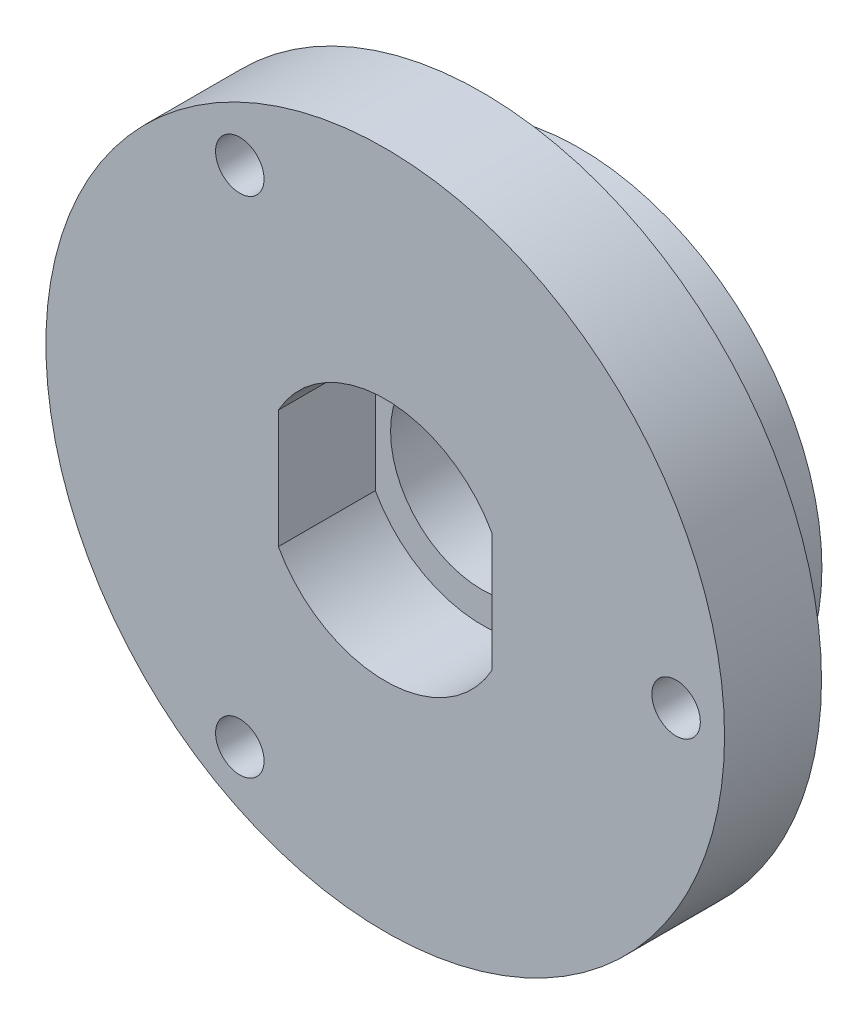
ISO-10303-21;
HEADER;
FILE_DESCRIPTION(('STEP AP214'),'2;1');
FILE_NAME('part.step','',(''),(''),'','','');
FILE_SCHEMA(('AUTOMOTIVE_DESIGN { 1 0 10303 214 1 1 1 1 }'));
ENDSEC;
DATA;
#1=APPLICATION_CONTEXT('core data for automotive mechanical design processes');
#2=APPLICATION_PROTOCOL_DEFINITION('international standard','automotive_design',2000,#1);
#3=PRODUCT_CONTEXT('',#1,'mechanical');
#4=PRODUCT('Part','Part','',(#3));
#5=PRODUCT_RELATED_PRODUCT_CATEGORY('part','',(#4));
#6=PRODUCT_DEFINITION_FORMATION('','',#4);
#7=PRODUCT_DEFINITION_CONTEXT('part definition',#1,'design');
#8=PRODUCT_DEFINITION('design','',#6,#7);
#9=PRODUCT_DEFINITION_SHAPE('','',#8);
#10=(LENGTH_UNIT() NAMED_UNIT(*) SI_UNIT(.MILLI.,.METRE.));
#11=(NAMED_UNIT(*) PLANE_ANGLE_UNIT() SI_UNIT($,.RADIAN.));
#12=(NAMED_UNIT(*) SI_UNIT($,.STERADIAN.) SOLID_ANGLE_UNIT());
#13=UNCERTAINTY_MEASURE_WITH_UNIT(LENGTH_MEASURE(1.E-05),#10,'distance_accuracy_value','');
#14=(GEOMETRIC_REPRESENTATION_CONTEXT(3) GLOBAL_UNCERTAINTY_ASSIGNED_CONTEXT((#13)) GLOBAL_UNIT_ASSIGNED_CONTEXT((#10,
#11,#12)) REPRESENTATION_CONTEXT('',''));
#15=CARTESIAN_POINT('',(0.,0.,0.));
#16=DIRECTION('',(0.,0.,1.));
#17=DIRECTION('',(1.,0.,0.));
#18=AXIS2_PLACEMENT_3D('',#15,#16,#17);
#19=CARTESIAN_POINT('',(0.,0.,6.3630063500127));
#20=DIRECTION('',(0.,0.,1.));
#21=DIRECTION('',(1.,0.,0.));
#22=AXIS2_PLACEMENT_3D('',#19,#20,#21);
#23=PLANE('',#22);
#24=CARTESIAN_POINT('',(-4.76250000000004,8.24889197104675,6.3630063500127));
#25=DIRECTION('',(0.,0.,1.));
#26=DIRECTION('',(1.,0.,0.));
#27=AXIS2_PLACEMENT_3D('',#24,#25,#26);
#28=CIRCLE('',#27,0.79375);
#29=CARTESIAN_POINT('',(-3.96875000000004,8.24889197104675,6.3630063500127));
#30=VERTEX_POINT('',#29);
#31=EDGE_CURVE('E189',#30,#30,#28,.T.);
#32=ORIENTED_EDGE('',*,*,#31,.F.);
#33=EDGE_LOOP('',(#32));
#34=FACE_BOUND('',#33,.T.);
#35=CARTESIAN_POINT('',(9.525,0.,6.3630063500127));
#36=DIRECTION('',(0.,0.,1.));
#37=DIRECTION('',(1.,0.,0.));
#38=AXIS2_PLACEMENT_3D('',#35,#36,#37);
#39=CIRCLE('',#38,0.793749999999999);
#40=CARTESIAN_POINT('',(10.31875,0.,6.3630063500127));
#41=VERTEX_POINT('',#40);
#42=EDGE_CURVE('E203',#41,#41,#39,.T.);
#43=ORIENTED_EDGE('',*,*,#42,.F.);
#44=EDGE_LOOP('',(#43));
#45=FACE_BOUND('',#44,.T.);
#46=CARTESIAN_POINT('',(-4.76250000000004,-8.24889197104676,6.3630063500127));
#47=DIRECTION('',(0.,0.,1.));
#48=DIRECTION('',(1.,0.,0.));
#49=AXIS2_PLACEMENT_3D('',#46,#47,#48);
#50=CIRCLE('',#49,0.79375);
#51=CARTESIAN_POINT('',(-3.96875000000004,-8.24889197104676,6.3630063500127));
#52=VERTEX_POINT('',#51);
#53=EDGE_CURVE('E211',#52,#52,#50,.T.);
#54=ORIENTED_EDGE('',*,*,#53,.F.);
#55=EDGE_LOOP('',(#54));
#56=FACE_BOUND('',#55,.T.);
#57=CARTESIAN_POINT('',(0.,0.,6.3630063500127));
#58=DIRECTION('',(0.,0.,1.));
#59=DIRECTION('',(1.,0.,0.));
#60=AXIS2_PLACEMENT_3D('',#57,#58,#59);
#61=CIRCLE('',#60,11.1125);
#62=CARTESIAN_POINT('',(11.1125,0.,6.3630063500127));
#63=VERTEX_POINT('',#62);
#64=EDGE_CURVE('E126',#63,#63,#61,.T.);
#65=ORIENTED_EDGE('',*,*,#64,.T.);
#66=EDGE_LOOP('',(#65));
#67=FACE_BOUND('',#66,.T.);
#68=CARTESIAN_POINT('',(0.,0.,6.3630063500127));
#69=DIRECTION('',(0.,0.,1.));
#70=DIRECTION('',(1.,0.,0.));
#71=AXIS2_PLACEMENT_3D('',#68,#69,#70);
#72=CIRCLE('',#71,4.);
#73=CARTESIAN_POINT('',(3.49999539285411,1.9365,6.3630063500127));
#74=VERTEX_POINT('',#73);
#75=CARTESIAN_POINT('',(-3.49999539285411,1.9365,6.3630063500127));
#76=VERTEX_POINT('',#75);
#77=EDGE_CURVE('E102',#74,#76,#72,.T.);
#78=ORIENTED_EDGE('',*,*,#77,.F.);
#79=DIRECTION('',(0.,-1.,0.));
#80=VECTOR('',#79,1.);
#81=CARTESIAN_POINT('',(3.49999539285411,0.,6.3630063500127));
#82=LINE('',#81,#80);
#83=CARTESIAN_POINT('',(3.49999539285411,-1.9365,6.3630063500127));
#84=VERTEX_POINT('',#83);
#85=EDGE_CURVE('E59',#74,#84,#82,.T.);
#86=ORIENTED_EDGE('',*,*,#85,.T.);
#87=CARTESIAN_POINT('',(-3.49999539285411,-1.9365,6.3630063500127));
#88=VERTEX_POINT('',#87);
#89=EDGE_CURVE('E107',#88,#84,#72,.T.);
#90=ORIENTED_EDGE('',*,*,#89,.F.);
#91=DIRECTION('',(0.,1.,0.));
#92=VECTOR('',#91,1.);
#93=CARTESIAN_POINT('',(-3.49999539285411,0.,6.3630063500127));
#94=LINE('',#93,#92);
#95=EDGE_CURVE('E92',#88,#76,#94,.T.);
#96=ORIENTED_EDGE('',*,*,#95,.T.);
#97=EDGE_LOOP('',(#78,#86,#90,#96));
#98=FACE_BOUND('',#97,.T.);
#99=ADVANCED_FACE('F43',(#34,#45,#56,#67,#98),#23,.T.);
#100=CARTESIAN_POINT('',(0.,0.,3.188));
#101=DIRECTION('',(0.,0.,-1.));
#102=DIRECTION('',(-1.,0.,0.));
#103=AXIS2_PLACEMENT_3D('',#100,#101,#102);
#104=CYLINDRICAL_SURFACE('',#103,7.9375);
#105=CARTESIAN_POINT('',(0.,0.,3.188));
#106=DIRECTION('',(0.,0.,1.));
#107=DIRECTION('',(1.,0.,0.));
#108=AXIS2_PLACEMENT_3D('',#105,#106,#107);
#109=CIRCLE('',#108,7.9375);
#110=CARTESIAN_POINT('',(7.9375,0.,3.188));
#111=VERTEX_POINT('',#110);
#112=EDGE_CURVE('E11',#111,#111,#109,.T.);
#113=ORIENTED_EDGE('',*,*,#112,.F.);
#114=EDGE_LOOP('',(#113));
#115=FACE_BOUND('',#114,.T.);
#116=CARTESIAN_POINT('',(0.,0.,0.));
#117=DIRECTION('',(0.,0.,1.));
#118=DIRECTION('',(1.,0.,0.));
#119=AXIS2_PLACEMENT_3D('',#116,#117,#118);
#120=CIRCLE('',#119,7.9375);
#121=CARTESIAN_POINT('',(7.9375,0.,0.));
#122=VERTEX_POINT('',#121);
#123=EDGE_CURVE('E47',#122,#122,#120,.T.);
#124=ORIENTED_EDGE('',*,*,#123,.T.);
#125=EDGE_LOOP('',(#124));
#126=FACE_BOUND('',#125,.T.);
#127=ADVANCED_FACE('F45',(#115,#126),#104,.T.);
#128=CARTESIAN_POINT('',(0.,0.,0.));
#129=DIRECTION('',(0.,0.,1.));
#130=DIRECTION('',(1.,0.,0.));
#131=AXIS2_PLACEMENT_3D('',#128,#129,#130);
#132=PLANE('',#131);
#133=CARTESIAN_POINT('',(0.,0.,0.));
#134=DIRECTION('',(0.,0.,-1.));
#135=DIRECTION('',(-1.,0.,0.));
#136=AXIS2_PLACEMENT_3D('',#133,#134,#135);
#137=CIRCLE('',#136,3.);
#138=CARTESIAN_POINT('',(-3.,0.,0.));
#139=VERTEX_POINT('',#138);
#140=EDGE_CURVE('E198',#139,#139,#137,.T.);
#141=ORIENTED_EDGE('',*,*,#140,.F.);
#142=EDGE_LOOP('',(#141));
#143=FACE_BOUND('',#142,.T.);
#144=ORIENTED_EDGE('',*,*,#123,.F.);
#145=EDGE_LOOP('',(#144));
#146=FACE_BOUND('',#145,.T.);
#147=ADVANCED_FACE('F147',(#143,#146),#132,.F.);
#148=CARTESIAN_POINT('',(0.,0.,6.3630063500127));
#149=DIRECTION('',(0.,0.,-1.));
#150=DIRECTION('',(-1.,0.,0.));
#151=AXIS2_PLACEMENT_3D('',#148,#149,#150);
#152=CYLINDRICAL_SURFACE('',#151,11.1125);
#153=ORIENTED_EDGE('',*,*,#64,.F.);
#154=EDGE_LOOP('',(#153));
#155=FACE_BOUND('',#154,.T.);
#156=CARTESIAN_POINT('',(0.,0.,3.188));
#157=DIRECTION('',(0.,0.,1.));
#158=DIRECTION('',(1.,0.,0.));
#159=AXIS2_PLACEMENT_3D('',#156,#157,#158);
#160=CIRCLE('',#159,11.1125);
#161=CARTESIAN_POINT('',(11.1125,0.,3.188));
#162=VERTEX_POINT('',#161);
#163=EDGE_CURVE('E124',#162,#162,#160,.T.);
#164=ORIENTED_EDGE('',*,*,#163,.T.);
#165=EDGE_LOOP('',(#164));
#166=FACE_BOUND('',#165,.T.);
#167=ADVANCED_FACE('F134',(#155,#166),#152,.T.);
#168=CARTESIAN_POINT('',(0.,0.,3.188));
#169=DIRECTION('',(0.,0.,1.));
#170=DIRECTION('',(1.,0.,0.));
#171=AXIS2_PLACEMENT_3D('',#168,#169,#170);
#172=PLANE('',#171);
#173=CARTESIAN_POINT('',(-4.76250000000004,8.24889197104675,3.188));
#174=DIRECTION('',(0.,0.,1.));
#175=DIRECTION('',(1.,0.,0.));
#176=AXIS2_PLACEMENT_3D('',#173,#174,#175);
#177=CIRCLE('',#176,0.79375);
#178=CARTESIAN_POINT('',(-3.96875000000004,8.24889197104675,3.188));
#179=VERTEX_POINT('',#178);
#180=EDGE_CURVE('E191',#179,#179,#177,.F.);
#181=ORIENTED_EDGE('',*,*,#180,.F.);
#182=EDGE_LOOP('',(#181));
#183=FACE_BOUND('',#182,.T.);
#184=CARTESIAN_POINT('',(9.525,0.,3.188));
#185=DIRECTION('',(0.,0.,1.));
#186=DIRECTION('',(1.,0.,0.));
#187=AXIS2_PLACEMENT_3D('',#184,#185,#186);
#188=CIRCLE('',#187,0.793749999999999);
#189=CARTESIAN_POINT('',(10.31875,0.,3.188));
#190=VERTEX_POINT('',#189);
#191=EDGE_CURVE('E200',#190,#190,#188,.F.);
#192=ORIENTED_EDGE('',*,*,#191,.F.);
#193=EDGE_LOOP('',(#192));
#194=FACE_BOUND('',#193,.T.);
#195=CARTESIAN_POINT('',(-4.76250000000004,-8.24889197104676,3.188));
#196=DIRECTION('',(0.,0.,1.));
#197=DIRECTION('',(1.,0.,0.));
#198=AXIS2_PLACEMENT_3D('',#195,#196,#197);
#199=CIRCLE('',#198,0.79375);
#200=CARTESIAN_POINT('',(-3.96875000000004,-8.24889197104676,3.188));
#201=VERTEX_POINT('',#200);
#202=EDGE_CURVE('E207',#201,#201,#199,.F.);
#203=ORIENTED_EDGE('',*,*,#202,.F.);
#204=EDGE_LOOP('',(#203));
#205=FACE_BOUND('',#204,.T.);
#206=ORIENTED_EDGE('',*,*,#112,.T.);
#207=EDGE_LOOP('',(#206));
#208=FACE_BOUND('',#207,.T.);
#209=ORIENTED_EDGE('',*,*,#163,.F.);
#210=EDGE_LOOP('',(#209));
#211=FACE_BOUND('',#210,.T.);
#212=ADVANCED_FACE('F136',(#183,#194,#205,#208,#211),#172,.F.);
#213=CARTESIAN_POINT('',(3.49999539285411,0.,-7.44213974508332));
#214=DIRECTION('',(-1.,0.,0.));
#215=DIRECTION('',(0.,0.,1.));
#216=AXIS2_PLACEMENT_3D('',#213,#214,#215);
#217=PLANE('',#216);
#218=DIRECTION('',(0.,0.,1.));
#219=VECTOR('',#218,1.);
#220=CARTESIAN_POINT('',(3.49999539285411,-1.9365,-7.44213974508332));
#221=LINE('',#220,#219);
#222=CARTESIAN_POINT('',(3.49999539285411,-1.9365,3.188));
#223=VERTEX_POINT('',#222);
#224=EDGE_CURVE('E114',#223,#84,#221,.T.);
#225=ORIENTED_EDGE('',*,*,#224,.T.);
#226=ORIENTED_EDGE('',*,*,#85,.F.);
#227=DIRECTION('',(0.,0.,1.));
#228=VECTOR('',#227,1.);
#229=CARTESIAN_POINT('',(3.49999539285411,1.9365,-7.44213974508332));
#230=LINE('',#229,#228);
#231=CARTESIAN_POINT('',(3.49999539285411,1.9365,3.188));
#232=VERTEX_POINT('',#231);
#233=EDGE_CURVE('E99',#232,#74,#230,.T.);
#234=ORIENTED_EDGE('',*,*,#233,.F.);
#235=DIRECTION('',(0.,1.,0.));
#236=VECTOR('',#235,1.);
#237=CARTESIAN_POINT('',(3.49999539285411,0.,3.188));
#238=LINE('',#237,#236);
#239=EDGE_CURVE('E125',#223,#232,#238,.T.);
#240=ORIENTED_EDGE('',*,*,#239,.F.);
#241=EDGE_LOOP('',(#225,#226,#234,#240));
#242=FACE_BOUND('',#241,.T.);
#243=ADVANCED_FACE('F138',(#242),#217,.T.);
#244=CARTESIAN_POINT('',(0.,0.,-7.44213974508332));
#245=DIRECTION('',(0.,0.,1.));
#246=DIRECTION('',(1.,0.,0.));
#247=AXIS2_PLACEMENT_3D('',#244,#245,#246);
#248=CYLINDRICAL_SURFACE('',#247,4.);
#249=CARTESIAN_POINT('',(0.,0.,3.188));
#250=DIRECTION('',(0.,0.,1.));
#251=DIRECTION('',(1.,0.,0.));
#252=AXIS2_PLACEMENT_3D('',#249,#250,#251);
#253=CIRCLE('',#252,4.);
#254=CARTESIAN_POINT('',(-3.49999539285411,-1.9365,3.188));
#255=VERTEX_POINT('',#254);
#256=EDGE_CURVE('E67',#223,#255,#253,.F.);
#257=ORIENTED_EDGE('',*,*,#256,.T.);
#258=DIRECTION('',(0.,0.,1.));
#259=VECTOR('',#258,1.);
#260=CARTESIAN_POINT('',(-3.49999539285411,-1.9365,-7.44213974508332));
#261=LINE('',#260,#259);
#262=EDGE_CURVE('E98',#255,#88,#261,.T.);
#263=ORIENTED_EDGE('',*,*,#262,.T.);
#264=ORIENTED_EDGE('',*,*,#89,.T.);
#265=ORIENTED_EDGE('',*,*,#224,.F.);
#266=EDGE_LOOP('',(#257,#263,#264,#265));
#267=FACE_BOUND('',#266,.T.);
#268=ADVANCED_FACE('F145',(#267),#248,.F.);
#269=CARTESIAN_POINT('',(-3.49999539285411,0.,-7.44213974508332));
#270=DIRECTION('',(1.,0.,0.));
#271=DIRECTION('',(0.,0.,-1.));
#272=AXIS2_PLACEMENT_3D('',#269,#270,#271);
#273=PLANE('',#272);
#274=DIRECTION('',(0.,0.,1.));
#275=VECTOR('',#274,1.);
#276=CARTESIAN_POINT('',(-3.49999539285411,1.9365,-7.44213974508332));
#277=LINE('',#276,#275);
#278=CARTESIAN_POINT('',(-3.49999539285411,1.9365,3.188));
#279=VERTEX_POINT('',#278);
#280=EDGE_CURVE('E87',#279,#76,#277,.T.);
#281=ORIENTED_EDGE('',*,*,#280,.T.);
#282=ORIENTED_EDGE('',*,*,#95,.F.);
#283=ORIENTED_EDGE('',*,*,#262,.F.);
#284=DIRECTION('',(0.,-1.,0.));
#285=VECTOR('',#284,1.);
#286=CARTESIAN_POINT('',(-3.49999539285411,0.,3.188));
#287=LINE('',#286,#285);
#288=EDGE_CURVE('E94',#279,#255,#287,.T.);
#289=ORIENTED_EDGE('',*,*,#288,.F.);
#290=EDGE_LOOP('',(#281,#282,#283,#289));
#291=FACE_BOUND('',#290,.T.);
#292=ADVANCED_FACE('F89',(#291),#273,.T.);
#293=CARTESIAN_POINT('',(0.,0.,3.188));
#294=DIRECTION('',(0.,0.,1.));
#295=DIRECTION('',(1.,0.,0.));
#296=AXIS2_PLACEMENT_3D('',#293,#294,#295);
#297=CIRCLE('',#296,4.);
#298=EDGE_CURVE('E121',#279,#232,#297,.F.);
#299=ORIENTED_EDGE('',*,*,#298,.T.);
#300=ORIENTED_EDGE('',*,*,#233,.T.);
#301=ORIENTED_EDGE('',*,*,#77,.T.);
#302=ORIENTED_EDGE('',*,*,#280,.F.);
#303=EDGE_LOOP('',(#299,#300,#301,#302));
#304=FACE_BOUND('',#303,.T.);
#305=ADVANCED_FACE('F103',(#304),#248,.F.);
#306=CARTESIAN_POINT('',(0.,0.,3.188));
#307=DIRECTION('',(0.,0.,1.));
#308=DIRECTION('',(1.,0.,0.));
#309=AXIS2_PLACEMENT_3D('',#306,#307,#308);
#310=PLANE('',#309);
#311=CARTESIAN_POINT('',(0.,0.,3.188));
#312=DIRECTION('',(0.,0.,1.));
#313=DIRECTION('',(1.,0.,0.));
#314=AXIS2_PLACEMENT_3D('',#311,#312,#313);
#315=CIRCLE('',#314,3.);
#316=CARTESIAN_POINT('',(3.,0.,3.188));
#317=VERTEX_POINT('',#316);
#318=EDGE_CURVE('E193',#317,#317,#315,.F.);
#319=ORIENTED_EDGE('',*,*,#318,.T.);
#320=EDGE_LOOP('',(#319));
#321=FACE_BOUND('',#320,.T.);
#322=ORIENTED_EDGE('',*,*,#256,.F.);
#323=ORIENTED_EDGE('',*,*,#239,.T.);
#324=ORIENTED_EDGE('',*,*,#298,.F.);
#325=ORIENTED_EDGE('',*,*,#288,.T.);
#326=EDGE_LOOP('',(#322,#323,#324,#325));
#327=FACE_BOUND('',#326,.T.);
#328=ADVANCED_FACE('F166',(#321,#327),#310,.T.);
#329=CARTESIAN_POINT('',(0.,0.,6.3640063500127));
#330=DIRECTION('',(0.,0.,-1.));
#331=DIRECTION('',(-1.,0.,0.));
#332=AXIS2_PLACEMENT_3D('',#329,#330,#331);
#333=CYLINDRICAL_SURFACE('',#332,3.);
#334=ORIENTED_EDGE('',*,*,#318,.F.);
#335=EDGE_LOOP('',(#334));
#336=FACE_BOUND('',#335,.T.);
#337=ORIENTED_EDGE('',*,*,#140,.T.);
#338=EDGE_LOOP('',(#337));
#339=FACE_BOUND('',#338,.T.);
#340=ADVANCED_FACE('F169',(#336,#339),#333,.F.);
#341=CARTESIAN_POINT('',(-4.76250000000004,-8.24889197104676,-0.00100000000000013));
#342=DIRECTION('',(0.,0.,1.));
#343=DIRECTION('',(1.,0.,0.));
#344=AXIS2_PLACEMENT_3D('',#341,#342,#343);
#345=CYLINDRICAL_SURFACE('',#344,0.79375);
#346=ORIENTED_EDGE('',*,*,#53,.T.);
#347=EDGE_LOOP('',(#346));
#348=FACE_BOUND('',#347,.T.);
#349=ORIENTED_EDGE('',*,*,#202,.T.);
#350=EDGE_LOOP('',(#349));
#351=FACE_BOUND('',#350,.T.);
#352=ADVANCED_FACE('F173',(#348,#351),#345,.F.);
#353=CARTESIAN_POINT('',(9.525,0.,-0.00100000000000013));
#354=DIRECTION('',(0.,0.,1.));
#355=DIRECTION('',(1.,0.,0.));
#356=AXIS2_PLACEMENT_3D('',#353,#354,#355);
#357=CYLINDRICAL_SURFACE('',#356,0.793749999999999);
#358=ORIENTED_EDGE('',*,*,#42,.T.);
#359=EDGE_LOOP('',(#358));
#360=FACE_BOUND('',#359,.T.);
#361=ORIENTED_EDGE('',*,*,#191,.T.);
#362=EDGE_LOOP('',(#361));
#363=FACE_BOUND('',#362,.T.);
#364=ADVANCED_FACE('F177',(#360,#363),#357,.F.);
#365=CARTESIAN_POINT('',(-4.76250000000004,8.24889197104675,-0.00100000000000013));
#366=DIRECTION('',(0.,0.,1.));
#367=DIRECTION('',(1.,0.,0.));
#368=AXIS2_PLACEMENT_3D('',#365,#366,#367);
#369=CYLINDRICAL_SURFACE('',#368,0.79375);
#370=ORIENTED_EDGE('',*,*,#31,.T.);
#371=EDGE_LOOP('',(#370));
#372=FACE_BOUND('',#371,.T.);
#373=ORIENTED_EDGE('',*,*,#180,.T.);
#374=EDGE_LOOP('',(#373));
#375=FACE_BOUND('',#374,.T.);
#376=ADVANCED_FACE('F181',(#372,#375),#369,.F.);
#377=CLOSED_SHELL('',(#99,#127,#147,#167,#212,#243,#268,#292,#305,#328,#340,#352,#364,#376));
#378=MANIFOLD_SOLID_BREP('B2',#377);
#379=ADVANCED_BREP_SHAPE_REPRESENTATION('',(#18,#378),#14);
#380=SHAPE_DEFINITION_REPRESENTATION(#9,#379);
ENDSEC;
END-ISO-10303-21;
